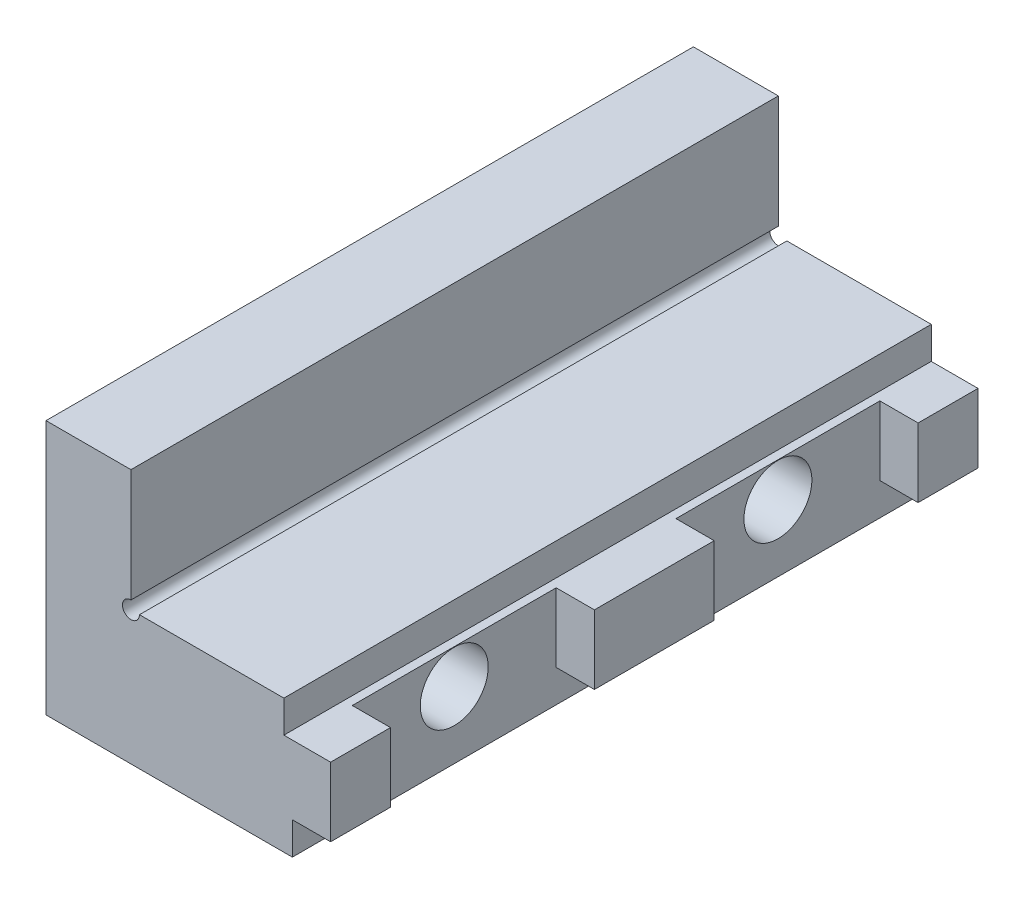
ISO-10303-21;
HEADER;
FILE_DESCRIPTION(('STEP AP214'),'2;1');
FILE_NAME('part.step','',(''),(''),'','','');
FILE_SCHEMA(('AUTOMOTIVE_DESIGN { 1 0 10303 214 1 1 1 1 }'));
ENDSEC;
DATA;
#1=APPLICATION_CONTEXT('core data for automotive mechanical design processes');
#2=APPLICATION_PROTOCOL_DEFINITION('international standard','automotive_design',2000,#1);
#3=PRODUCT_CONTEXT('',#1,'mechanical');
#4=PRODUCT('Part','Part','',(#3));
#5=PRODUCT_RELATED_PRODUCT_CATEGORY('part','',(#4));
#6=PRODUCT_DEFINITION_FORMATION('','',#4);
#7=PRODUCT_DEFINITION_CONTEXT('part definition',#1,'design');
#8=PRODUCT_DEFINITION('design','',#6,#7);
#9=PRODUCT_DEFINITION_SHAPE('','',#8);
#10=(LENGTH_UNIT() NAMED_UNIT(*) SI_UNIT(.MILLI.,.METRE.));
#11=(NAMED_UNIT(*) PLANE_ANGLE_UNIT() SI_UNIT($,.RADIAN.));
#12=(NAMED_UNIT(*) SI_UNIT($,.STERADIAN.) SOLID_ANGLE_UNIT());
#13=UNCERTAINTY_MEASURE_WITH_UNIT(LENGTH_MEASURE(1.E-05),#10,'distance_accuracy_value','');
#14=(GEOMETRIC_REPRESENTATION_CONTEXT(3) GLOBAL_UNCERTAINTY_ASSIGNED_CONTEXT((#13)) GLOBAL_UNIT_ASSIGNED_CONTEXT((#10,
#11,#12)) REPRESENTATION_CONTEXT('',''));
#15=CARTESIAN_POINT('',(0.,0.,0.));
#16=DIRECTION('',(0.,0.,1.));
#17=DIRECTION('',(1.,0.,0.));
#18=AXIS2_PLACEMENT_3D('',#15,#16,#17);
#19=CARTESIAN_POINT('',(0.,-11.8999610244505,38.1));
#20=DIRECTION('',(0.,-1.,0.));
#21=DIRECTION('',(0.,0.,-1.));
#22=AXIS2_PLACEMENT_3D('',#19,#20,#21);
#23=PLANE('',#22);
#24=DIRECTION('',(-1.,0.,0.));
#25=VECTOR('',#24,1.);
#26=CARTESIAN_POINT('',(0.,-11.8999610244505,31.05));
#27=LINE('',#26,#25);
#28=CARTESIAN_POINT('',(23.5,-11.8999610244505,31.05));
#29=VERTEX_POINT('',#28);
#30=CARTESIAN_POINT('',(19.,-11.8999610244505,31.05));
#31=VERTEX_POINT('',#30);
#32=EDGE_CURVE('E265',#29,#31,#27,.T.);
#33=ORIENTED_EDGE('',*,*,#32,.F.);
#34=DIRECTION('',(0.,0.,-1.));
#35=VECTOR('',#34,1.);
#36=CARTESIAN_POINT('',(23.5,-11.8999610244505,38.1));
#37=LINE('',#36,#35);
#38=CARTESIAN_POINT('',(23.5,-11.8999610244505,38.1));
#39=VERTEX_POINT('',#38);
#40=EDGE_CURVE('E189',#39,#29,#37,.T.);
#41=ORIENTED_EDGE('',*,*,#40,.F.);
#42=DIRECTION('',(-1.,0.,0.));
#43=VECTOR('',#42,1.);
#44=CARTESIAN_POINT('',(0.,-11.8999610244505,38.1));
#45=LINE('',#44,#43);
#46=CARTESIAN_POINT('',(19.,-11.8999610244505,38.1));
#47=VERTEX_POINT('',#46);
#48=EDGE_CURVE('E318',#39,#47,#45,.T.);
#49=ORIENTED_EDGE('',*,*,#48,.T.);
#50=DIRECTION('',(0.,0.,-1.));
#51=VECTOR('',#50,1.);
#52=CARTESIAN_POINT('',(19.,-11.8999610244505,38.1));
#53=LINE('',#52,#51);
#54=EDGE_CURVE('E191',#47,#31,#53,.T.);
#55=ORIENTED_EDGE('',*,*,#54,.T.);
#56=EDGE_LOOP('',(#33,#41,#49,#55));
#57=FACE_BOUND('',#56,.T.);
#58=ADVANCED_FACE('F37',(#57),#23,.T.);
#59=DIRECTION('',(1.,0.,0.));
#60=VECTOR('',#59,1.);
#61=CARTESIAN_POINT('',(0.,-11.8999610244505,7.05));
#62=LINE('',#61,#60);
#63=CARTESIAN_POINT('',(19.,-11.8999610244505,7.05));
#64=VERTEX_POINT('',#63);
#65=CARTESIAN_POINT('',(23.5,-11.8999610244505,7.05));
#66=VERTEX_POINT('',#65);
#67=EDGE_CURVE('E261',#64,#66,#62,.T.);
#68=ORIENTED_EDGE('',*,*,#67,.F.);
#69=CARTESIAN_POINT('',(19.,-11.8999610244505,-7.05));
#70=VERTEX_POINT('',#69);
#71=EDGE_CURVE('E188',#64,#70,#53,.T.);
#72=ORIENTED_EDGE('',*,*,#71,.T.);
#73=DIRECTION('',(-1.,0.,0.));
#74=VECTOR('',#73,1.);
#75=CARTESIAN_POINT('',(0.,-11.8999610244505,-7.05));
#76=LINE('',#75,#74);
#77=CARTESIAN_POINT('',(23.5,-11.8999610244505,-7.05));
#78=VERTEX_POINT('',#77);
#79=EDGE_CURVE('E258',#78,#70,#76,.T.);
#80=ORIENTED_EDGE('',*,*,#79,.F.);
#81=EDGE_CURVE('E194',#66,#78,#37,.T.);
#82=ORIENTED_EDGE('',*,*,#81,.F.);
#83=EDGE_LOOP('',(#68,#72,#80,#82));
#84=FACE_BOUND('',#83,.T.);
#85=ADVANCED_FACE('F360',(#84),#23,.T.);
#86=CARTESIAN_POINT('',(23.5,0.,38.1));
#87=DIRECTION('',(1.,0.,0.));
#88=DIRECTION('',(0.,1.,0.));
#89=AXIS2_PLACEMENT_3D('',#86,#87,#88);
#90=PLANE('',#89);
#91=DIRECTION('',(0.,-1.,0.));
#92=VECTOR('',#91,1.);
#93=CARTESIAN_POINT('',(23.5,0.,31.05));
#94=LINE('',#93,#92);
#95=CARTESIAN_POINT('',(23.5,-3.77996102445055,31.05));
#96=VERTEX_POINT('',#95);
#97=EDGE_CURVE('E263',#96,#29,#94,.T.);
#98=ORIENTED_EDGE('',*,*,#97,.F.);
#99=DIRECTION('',(0.,0.,-1.));
#100=VECTOR('',#99,1.);
#101=CARTESIAN_POINT('',(23.5,-3.77996102445055,38.1));
#102=LINE('',#101,#100);
#103=CARTESIAN_POINT('',(23.5,-3.77996102445055,38.1));
#104=VERTEX_POINT('',#103);
#105=EDGE_CURVE('E339',#104,#96,#102,.T.);
#106=ORIENTED_EDGE('',*,*,#105,.F.);
#107=DIRECTION('',(0.,-1.,0.));
#108=VECTOR('',#107,1.);
#109=CARTESIAN_POINT('',(23.5,0.,38.1));
#110=LINE('',#109,#108);
#111=EDGE_CURVE('E320',#104,#39,#110,.T.);
#112=ORIENTED_EDGE('',*,*,#111,.T.);
#113=ORIENTED_EDGE('',*,*,#40,.T.);
#114=EDGE_LOOP('',(#98,#106,#112,#113));
#115=FACE_BOUND('',#114,.T.);
#116=ADVANCED_FACE('F351',(#115),#90,.T.);
#117=DIRECTION('',(0.,1.,0.));
#118=VECTOR('',#117,1.);
#119=CARTESIAN_POINT('',(23.5,0.,7.05));
#120=LINE('',#119,#118);
#121=CARTESIAN_POINT('',(23.5,-3.77996102445055,7.05));
#122=VERTEX_POINT('',#121);
#123=EDGE_CURVE('E243',#66,#122,#120,.T.);
#124=ORIENTED_EDGE('',*,*,#123,.F.);
#125=ORIENTED_EDGE('',*,*,#81,.T.);
#126=DIRECTION('',(0.,-1.,0.));
#127=VECTOR('',#126,1.);
#128=CARTESIAN_POINT('',(23.5,0.,-7.05));
#129=LINE('',#128,#127);
#130=CARTESIAN_POINT('',(23.5,-3.77996102445055,-7.05));
#131=VERTEX_POINT('',#130);
#132=EDGE_CURVE('E180',#131,#78,#129,.T.);
#133=ORIENTED_EDGE('',*,*,#132,.F.);
#134=EDGE_CURVE('E340',#122,#131,#102,.T.);
#135=ORIENTED_EDGE('',*,*,#134,.F.);
#136=EDGE_LOOP('',(#124,#125,#133,#135));
#137=FACE_BOUND('',#136,.T.);
#138=ADVANCED_FACE('F352',(#137),#90,.T.);
#139=CARTESIAN_POINT('',(0.,0.,38.1));
#140=DIRECTION('',(0.,0.,-1.));
#141=DIRECTION('',(-1.,0.,0.));
#142=AXIS2_PLACEMENT_3D('',#139,#140,#141);
#143=CYLINDRICAL_SURFACE('',#142,1.);
#144=DIRECTION('',(0.,0.,-1.));
#145=VECTOR('',#144,1.);
#146=CARTESIAN_POINT('',(1.,0.,38.1));
#147=LINE('',#146,#145);
#148=CARTESIAN_POINT('',(1.,0.,38.1));
#149=VERTEX_POINT('',#148);
#150=CARTESIAN_POINT('',(1.,0.,-38.1));
#151=VERTEX_POINT('',#150);
#152=EDGE_CURVE('E332',#149,#151,#147,.T.);
#153=ORIENTED_EDGE('',*,*,#152,.T.);
#154=CARTESIAN_POINT('',(0.,0.,-38.1));
#155=DIRECTION('',(0.,0.,1.));
#156=DIRECTION('',(1.,0.,0.));
#157=AXIS2_PLACEMENT_3D('',#154,#155,#156);
#158=CIRCLE('',#157,1.);
#159=CARTESIAN_POINT('',(0.,1.,-38.1));
#160=VERTEX_POINT('',#159);
#161=EDGE_CURVE('E225',#160,#151,#158,.T.);
#162=ORIENTED_EDGE('',*,*,#161,.F.);
#163=DIRECTION('',(0.,0.,-1.));
#164=VECTOR('',#163,1.);
#165=CARTESIAN_POINT('',(0.,1.,38.1));
#166=LINE('',#165,#164);
#167=CARTESIAN_POINT('',(0.,1.,38.1));
#168=VERTEX_POINT('',#167);
#169=EDGE_CURVE('E210',#168,#160,#166,.T.);
#170=ORIENTED_EDGE('',*,*,#169,.F.);
#171=CARTESIAN_POINT('',(0.,0.,38.1));
#172=DIRECTION('',(0.,0.,1.));
#173=DIRECTION('',(1.,0.,0.));
#174=AXIS2_PLACEMENT_3D('',#171,#172,#173);
#175=CIRCLE('',#174,1.);
#176=EDGE_CURVE('E301',#168,#149,#175,.T.);
#177=ORIENTED_EDGE('',*,*,#176,.T.);
#178=EDGE_LOOP('',(#153,#162,#170,#177));
#179=FACE_BOUND('',#178,.T.);
#180=ADVANCED_FACE('F39',(#179),#143,.F.);
#181=CARTESIAN_POINT('',(0.,0.,38.1));
#182=DIRECTION('',(1.,0.,0.));
#183=DIRECTION('',(0.,1.,0.));
#184=AXIS2_PLACEMENT_3D('',#181,#182,#183);
#185=PLANE('',#184);
#186=ORIENTED_EDGE('',*,*,#169,.T.);
#187=DIRECTION('',(0.,-1.,0.));
#188=VECTOR('',#187,1.);
#189=CARTESIAN_POINT('',(0.,0.,-38.1));
#190=LINE('',#189,#188);
#191=CARTESIAN_POINT('',(0.,14.2850389755494,-38.1));
#192=VERTEX_POINT('',#191);
#193=EDGE_CURVE('E274',#192,#160,#190,.T.);
#194=ORIENTED_EDGE('',*,*,#193,.F.);
#195=DIRECTION('',(0.,0.,-1.));
#196=VECTOR('',#195,1.);
#197=CARTESIAN_POINT('',(0.,14.2850389755494,38.1));
#198=LINE('',#197,#196);
#199=CARTESIAN_POINT('',(0.,14.2850389755494,38.1));
#200=VERTEX_POINT('',#199);
#201=EDGE_CURVE('E208',#200,#192,#198,.T.);
#202=ORIENTED_EDGE('',*,*,#201,.F.);
#203=DIRECTION('',(0.,-1.,0.));
#204=VECTOR('',#203,1.);
#205=CARTESIAN_POINT('',(0.,0.,38.1));
#206=LINE('',#205,#204);
#207=EDGE_CURVE('E304',#200,#168,#206,.T.);
#208=ORIENTED_EDGE('',*,*,#207,.T.);
#209=EDGE_LOOP('',(#186,#194,#202,#208));
#210=FACE_BOUND('',#209,.T.);
#211=ADVANCED_FACE('F383',(#210),#185,.T.);
#212=CARTESIAN_POINT('',(0.,14.2850389755494,38.1));
#213=DIRECTION('',(0.,1.,0.));
#214=DIRECTION('',(0.,0.,1.));
#215=AXIS2_PLACEMENT_3D('',#212,#213,#214);
#216=PLANE('',#215);
#217=ORIENTED_EDGE('',*,*,#201,.T.);
#218=DIRECTION('',(1.,0.,0.));
#219=VECTOR('',#218,1.);
#220=CARTESIAN_POINT('',(0.,14.2850389755494,-38.1));
#221=LINE('',#220,#219);
#222=CARTESIAN_POINT('',(-10.,14.2850389755494,-38.1));
#223=VERTEX_POINT('',#222);
#224=EDGE_CURVE('E277',#223,#192,#221,.T.);
#225=ORIENTED_EDGE('',*,*,#224,.F.);
#226=DIRECTION('',(0.,0.,-1.));
#227=VECTOR('',#226,1.);
#228=CARTESIAN_POINT('',(-10.,14.2850389755494,38.1));
#229=LINE('',#228,#227);
#230=CARTESIAN_POINT('',(-10.,14.2850389755494,38.1));
#231=VERTEX_POINT('',#230);
#232=EDGE_CURVE('E204',#231,#223,#229,.T.);
#233=ORIENTED_EDGE('',*,*,#232,.F.);
#234=DIRECTION('',(1.,0.,0.));
#235=VECTOR('',#234,1.);
#236=CARTESIAN_POINT('',(0.,14.2850389755494,38.1));
#237=LINE('',#236,#235);
#238=EDGE_CURVE('E307',#231,#200,#237,.T.);
#239=ORIENTED_EDGE('',*,*,#238,.T.);
#240=EDGE_LOOP('',(#217,#225,#233,#239));
#241=FACE_BOUND('',#240,.T.);
#242=ADVANCED_FACE('F380',(#241),#216,.T.);
#243=CARTESIAN_POINT('',(-10.,0.,38.1));
#244=DIRECTION('',(-1.,0.,0.));
#245=DIRECTION('',(0.,0.,1.));
#246=AXIS2_PLACEMENT_3D('',#243,#244,#245);
#247=PLANE('',#246);
#248=CARTESIAN_POINT('',(-10.,-7.83996102445055,19.05));
#249=DIRECTION('',(-1.,0.,0.));
#250=DIRECTION('',(0.,0.,1.));
#251=AXIS2_PLACEMENT_3D('',#248,#249,#250);
#252=CIRCLE('',#251,6.5);
#253=CARTESIAN_POINT('',(-10.,-7.83996102445055,25.55));
#254=VERTEX_POINT('',#253);
#255=EDGE_CURVE('E222',#254,#254,#252,.T.);
#256=ORIENTED_EDGE('',*,*,#255,.F.);
#257=EDGE_LOOP('',(#256));
#258=FACE_BOUND('',#257,.T.);
#259=CARTESIAN_POINT('',(-10.,-7.83996102445054,-19.05));
#260=DIRECTION('',(-1.,0.,0.));
#261=DIRECTION('',(0.,0.,1.));
#262=AXIS2_PLACEMENT_3D('',#259,#260,#261);
#263=CIRCLE('',#262,6.5);
#264=CARTESIAN_POINT('',(-10.,-7.83996102445054,-12.55));
#265=VERTEX_POINT('',#264);
#266=EDGE_CURVE('E219',#265,#265,#263,.T.);
#267=ORIENTED_EDGE('',*,*,#266,.F.);
#268=EDGE_LOOP('',(#267));
#269=FACE_BOUND('',#268,.T.);
#270=ORIENTED_EDGE('',*,*,#232,.T.);
#271=DIRECTION('',(0.,1.,0.));
#272=VECTOR('',#271,1.);
#273=CARTESIAN_POINT('',(-10.,0.,-38.1));
#274=LINE('',#273,#272);
#275=CARTESIAN_POINT('',(-10.,-15.7149610244506,-38.1));
#276=VERTEX_POINT('',#275);
#277=EDGE_CURVE('E280',#276,#223,#274,.T.);
#278=ORIENTED_EDGE('',*,*,#277,.F.);
#279=DIRECTION('',(0.,0.,-1.));
#280=VECTOR('',#279,1.);
#281=CARTESIAN_POINT('',(-10.,-15.7149610244506,38.1));
#282=LINE('',#281,#280);
#283=CARTESIAN_POINT('',(-10.,-15.7149610244506,38.1));
#284=VERTEX_POINT('',#283);
#285=EDGE_CURVE('E202',#284,#276,#282,.T.);
#286=ORIENTED_EDGE('',*,*,#285,.F.);
#287=DIRECTION('',(0.,1.,0.));
#288=VECTOR('',#287,1.);
#289=CARTESIAN_POINT('',(-10.,0.,38.1));
#290=LINE('',#289,#288);
#291=EDGE_CURVE('E310',#284,#231,#290,.T.);
#292=ORIENTED_EDGE('',*,*,#291,.T.);
#293=EDGE_LOOP('',(#270,#278,#286,#292));
#294=FACE_BOUND('',#293,.T.);
#295=ADVANCED_FACE('F376',(#258,#269,#294),#247,.T.);
#296=CARTESIAN_POINT('',(0.,-15.7149610244506,38.1));
#297=DIRECTION('',(0.,-1.,0.));
#298=DIRECTION('',(1.,0.,0.));
#299=AXIS2_PLACEMENT_3D('',#296,#297,#298);
#300=PLANE('',#299);
#301=ORIENTED_EDGE('',*,*,#285,.T.);
#302=DIRECTION('',(-1.,0.,0.));
#303=VECTOR('',#302,1.);
#304=CARTESIAN_POINT('',(0.,-15.7149610244506,-38.1));
#305=LINE('',#304,#303);
#306=CARTESIAN_POINT('',(19.,-15.7149610244505,-38.1));
#307=VERTEX_POINT('',#306);
#308=EDGE_CURVE('E283',#307,#276,#305,.T.);
#309=ORIENTED_EDGE('',*,*,#308,.F.);
#310=DIRECTION('',(0.,0.,-1.));
#311=VECTOR('',#310,1.);
#312=CARTESIAN_POINT('',(19.,-15.7149610244505,38.1));
#313=LINE('',#312,#311);
#314=CARTESIAN_POINT('',(19.,-15.7149610244505,38.1));
#315=VERTEX_POINT('',#314);
#316=EDGE_CURVE('E198',#315,#307,#313,.T.);
#317=ORIENTED_EDGE('',*,*,#316,.F.);
#318=DIRECTION('',(-1.,0.,0.));
#319=VECTOR('',#318,1.);
#320=CARTESIAN_POINT('',(0.,-15.7149610244506,38.1));
#321=LINE('',#320,#319);
#322=EDGE_CURVE('E313',#315,#284,#321,.T.);
#323=ORIENTED_EDGE('',*,*,#322,.T.);
#324=EDGE_LOOP('',(#301,#309,#317,#323));
#325=FACE_BOUND('',#324,.T.);
#326=ADVANCED_FACE('F373',(#325),#300,.T.);
#327=CARTESIAN_POINT('',(19.,0.,38.1));
#328=DIRECTION('',(1.,0.,0.));
#329=DIRECTION('',(0.,1.,0.));
#330=AXIS2_PLACEMENT_3D('',#327,#328,#329);
#331=PLANE('',#330);
#332=CARTESIAN_POINT('',(19.,-11.8999610244505,-31.05));
#333=VERTEX_POINT('',#332);
#334=CARTESIAN_POINT('',(19.,-11.8999610244505,-38.1));
#335=VERTEX_POINT('',#334);
#336=EDGE_CURVE('E177',#333,#335,#53,.T.);
#337=ORIENTED_EDGE('',*,*,#336,.F.);
#338=DIRECTION('',(0.,-1.,0.));
#339=VECTOR('',#338,1.);
#340=CARTESIAN_POINT('',(19.,0.,-31.05));
#341=LINE('',#340,#339);
#342=CARTESIAN_POINT('',(19.,-3.77996102445055,-31.05));
#343=VERTEX_POINT('',#342);
#344=EDGE_CURVE('E59',#343,#333,#341,.T.);
#345=ORIENTED_EDGE('',*,*,#344,.F.);
#346=DIRECTION('',(0.,0.,1.));
#347=VECTOR('',#346,1.);
#348=CARTESIAN_POINT('',(19.,-3.77996102445055,38.1));
#349=LINE('',#348,#347);
#350=CARTESIAN_POINT('',(19.,-3.77996102445055,-7.05));
#351=VERTEX_POINT('',#350);
#352=EDGE_CURVE('E229',#343,#351,#349,.T.);
#353=ORIENTED_EDGE('',*,*,#352,.T.);
#354=DIRECTION('',(0.,1.,0.));
#355=VECTOR('',#354,1.);
#356=CARTESIAN_POINT('',(19.,0.,-7.05));
#357=LINE('',#356,#355);
#358=EDGE_CURVE('E171',#70,#351,#357,.T.);
#359=ORIENTED_EDGE('',*,*,#358,.F.);
#360=ORIENTED_EDGE('',*,*,#71,.F.);
#361=DIRECTION('',(0.,-1.,0.));
#362=VECTOR('',#361,1.);
#363=CARTESIAN_POINT('',(19.,0.,7.05));
#364=LINE('',#363,#362);
#365=CARTESIAN_POINT('',(19.,-3.77996102445055,7.05000000000001));
#366=VERTEX_POINT('',#365);
#367=EDGE_CURVE('E52',#366,#64,#364,.T.);
#368=ORIENTED_EDGE('',*,*,#367,.F.);
#369=DIRECTION('',(0.,0.,1.));
#370=VECTOR('',#369,1.);
#371=CARTESIAN_POINT('',(19.,-3.77996102445055,38.1));
#372=LINE('',#371,#370);
#373=CARTESIAN_POINT('',(19.,-3.77996102445055,31.05));
#374=VERTEX_POINT('',#373);
#375=EDGE_CURVE('E234',#366,#374,#372,.T.);
#376=ORIENTED_EDGE('',*,*,#375,.T.);
#377=DIRECTION('',(0.,1.,0.));
#378=VECTOR('',#377,1.);
#379=CARTESIAN_POINT('',(19.,0.,31.05));
#380=LINE('',#379,#378);
#381=EDGE_CURVE('E230',#31,#374,#380,.T.);
#382=ORIENTED_EDGE('',*,*,#381,.F.);
#383=ORIENTED_EDGE('',*,*,#54,.F.);
#384=DIRECTION('',(0.,-1.,0.));
#385=VECTOR('',#384,1.);
#386=CARTESIAN_POINT('',(19.,0.,38.1));
#387=LINE('',#386,#385);
#388=EDGE_CURVE('E316',#47,#315,#387,.T.);
#389=ORIENTED_EDGE('',*,*,#388,.T.);
#390=ORIENTED_EDGE('',*,*,#316,.T.);
#391=DIRECTION('',(0.,-1.,0.));
#392=VECTOR('',#391,1.);
#393=CARTESIAN_POINT('',(19.,0.,-38.1));
#394=LINE('',#393,#392);
#395=EDGE_CURVE('E187',#335,#307,#394,.T.);
#396=ORIENTED_EDGE('',*,*,#395,.F.);
#397=EDGE_LOOP('',(#337,#345,#353,#359,#360,#368,#376,#382,#383,#389,#390,#396));
#398=FACE_BOUND('',#397,.T.);
#399=CARTESIAN_POINT('',(19.,-7.83996102445054,-19.05));
#400=DIRECTION('',(-1.,0.,0.));
#401=DIRECTION('',(0.,-1.,0.));
#402=AXIS2_PLACEMENT_3D('',#399,#400,#401);
#403=CIRCLE('',#402,4.);
#404=CARTESIAN_POINT('',(19.,-11.8399610244505,-19.05));
#405=VERTEX_POINT('',#404);
#406=EDGE_CURVE('E226',#405,#405,#403,.F.);
#407=ORIENTED_EDGE('',*,*,#406,.F.);
#408=EDGE_LOOP('',(#407));
#409=FACE_BOUND('',#408,.T.);
#410=CARTESIAN_POINT('',(19.,-7.83996102445055,19.05));
#411=DIRECTION('',(-1.,0.,0.));
#412=DIRECTION('',(0.,-1.,0.));
#413=AXIS2_PLACEMENT_3D('',#410,#411,#412);
#414=CIRCLE('',#413,4.);
#415=CARTESIAN_POINT('',(19.,-11.8399610244505,19.05));
#416=VERTEX_POINT('',#415);
#417=EDGE_CURVE('E231',#416,#416,#414,.F.);
#418=ORIENTED_EDGE('',*,*,#417,.F.);
#419=EDGE_LOOP('',(#418));
#420=FACE_BOUND('',#419,.T.);
#421=ADVANCED_FACE('F184',(#398,#409,#420),#331,.T.);
#422=DIRECTION('',(1.,0.,0.));
#423=VECTOR('',#422,1.);
#424=CARTESIAN_POINT('',(0.,-11.8999610244505,-31.05));
#425=LINE('',#424,#423);
#426=CARTESIAN_POINT('',(23.5,-11.8999610244505,-31.05));
#427=VERTEX_POINT('',#426);
#428=EDGE_CURVE('E166',#333,#427,#425,.T.);
#429=ORIENTED_EDGE('',*,*,#428,.F.);
#430=ORIENTED_EDGE('',*,*,#336,.T.);
#431=DIRECTION('',(-1.,0.,0.));
#432=VECTOR('',#431,1.);
#433=CARTESIAN_POINT('',(0.,-11.8999610244505,-38.1));
#434=LINE('',#433,#432);
#435=CARTESIAN_POINT('',(23.5,-11.8999610244505,-38.1));
#436=VERTEX_POINT('',#435);
#437=EDGE_CURVE('E287',#436,#335,#434,.T.);
#438=ORIENTED_EDGE('',*,*,#437,.F.);
#439=EDGE_CURVE('E179',#427,#436,#37,.T.);
#440=ORIENTED_EDGE('',*,*,#439,.F.);
#441=EDGE_LOOP('',(#429,#430,#438,#440));
#442=FACE_BOUND('',#441,.T.);
#443=ADVANCED_FACE('F175',(#442),#23,.T.);
#444=DIRECTION('',(0.,1.,0.));
#445=VECTOR('',#444,1.);
#446=CARTESIAN_POINT('',(23.5,0.,-31.05));
#447=LINE('',#446,#445);
#448=CARTESIAN_POINT('',(23.5,-3.77996102445055,-31.05));
#449=VERTEX_POINT('',#448);
#450=EDGE_CURVE('E181',#427,#449,#447,.T.);
#451=ORIENTED_EDGE('',*,*,#450,.F.);
#452=ORIENTED_EDGE('',*,*,#439,.T.);
#453=DIRECTION('',(0.,-1.,0.));
#454=VECTOR('',#453,1.);
#455=CARTESIAN_POINT('',(23.5,0.,-38.1));
#456=LINE('',#455,#454);
#457=CARTESIAN_POINT('',(23.5,-3.77996102445055,-38.1));
#458=VERTEX_POINT('',#457);
#459=EDGE_CURVE('E289',#458,#436,#456,.T.);
#460=ORIENTED_EDGE('',*,*,#459,.F.);
#461=EDGE_CURVE('E338',#449,#458,#102,.T.);
#462=ORIENTED_EDGE('',*,*,#461,.F.);
#463=EDGE_LOOP('',(#451,#452,#460,#462));
#464=FACE_BOUND('',#463,.T.);
#465=ADVANCED_FACE('F348',(#464),#90,.T.);
#466=CARTESIAN_POINT('',(0.,-3.77996102445055,38.1));
#467=DIRECTION('',(0.,1.,0.));
#468=DIRECTION('',(0.,0.,1.));
#469=AXIS2_PLACEMENT_3D('',#466,#467,#468);
#470=PLANE('',#469);
#471=DIRECTION('',(1.,0.,0.));
#472=VECTOR('',#471,1.);
#473=CARTESIAN_POINT('',(0.,-3.77996102445055,31.05));
#474=LINE('',#473,#472);
#475=EDGE_CURVE('E11',#374,#96,#474,.T.);
#476=ORIENTED_EDGE('',*,*,#475,.F.);
#477=ORIENTED_EDGE('',*,*,#375,.F.);
#478=DIRECTION('',(-1.,0.,0.));
#479=VECTOR('',#478,1.);
#480=CARTESIAN_POINT('',(0.,-3.77996102445055,7.05));
#481=LINE('',#480,#479);
#482=EDGE_CURVE('E45',#122,#366,#481,.T.);
#483=ORIENTED_EDGE('',*,*,#482,.F.);
#484=ORIENTED_EDGE('',*,*,#134,.T.);
#485=DIRECTION('',(1.,0.,0.));
#486=VECTOR('',#485,1.);
#487=CARTESIAN_POINT('',(0.,-3.77996102445055,-7.05));
#488=LINE('',#487,#486);
#489=EDGE_CURVE('E236',#351,#131,#488,.T.);
#490=ORIENTED_EDGE('',*,*,#489,.F.);
#491=ORIENTED_EDGE('',*,*,#352,.F.);
#492=DIRECTION('',(-1.,0.,0.));
#493=VECTOR('',#492,1.);
#494=CARTESIAN_POINT('',(0.,-3.77996102445055,-31.05));
#495=LINE('',#494,#493);
#496=EDGE_CURVE('E169',#449,#343,#495,.T.);
#497=ORIENTED_EDGE('',*,*,#496,.F.);
#498=ORIENTED_EDGE('',*,*,#461,.T.);
#499=DIRECTION('',(1.,0.,0.));
#500=VECTOR('',#499,1.);
#501=CARTESIAN_POINT('',(0.,-3.77996102445055,-38.1));
#502=LINE('',#501,#500);
#503=CARTESIAN_POINT('',(18.,-3.77996102445055,-38.1));
#504=VERTEX_POINT('',#503);
#505=EDGE_CURVE('E292',#504,#458,#502,.T.);
#506=ORIENTED_EDGE('',*,*,#505,.F.);
#507=DIRECTION('',(0.,0.,-1.));
#508=VECTOR('',#507,1.);
#509=CARTESIAN_POINT('',(18.,-3.77996102445055,38.1));
#510=LINE('',#509,#508);
#511=CARTESIAN_POINT('',(18.,-3.77996102445055,38.1));
#512=VERTEX_POINT('',#511);
#513=EDGE_CURVE('E336',#512,#504,#510,.T.);
#514=ORIENTED_EDGE('',*,*,#513,.F.);
#515=DIRECTION('',(1.,0.,0.));
#516=VECTOR('',#515,1.);
#517=CARTESIAN_POINT('',(0.,-3.77996102445055,38.1));
#518=LINE('',#517,#516);
#519=EDGE_CURVE('E323',#512,#104,#518,.T.);
#520=ORIENTED_EDGE('',*,*,#519,.T.);
#521=ORIENTED_EDGE('',*,*,#105,.T.);
#522=EDGE_LOOP('',(#476,#477,#483,#484,#490,#491,#497,#498,#506,#514,#520,#521));
#523=FACE_BOUND('',#522,.T.);
#524=ADVANCED_FACE('F248',(#523),#470,.T.);
#525=CARTESIAN_POINT('',(18.,0.,38.1));
#526=DIRECTION('',(1.,0.,0.));
#527=DIRECTION('',(0.,1.,0.));
#528=AXIS2_PLACEMENT_3D('',#525,#526,#527);
#529=PLANE('',#528);
#530=ORIENTED_EDGE('',*,*,#513,.T.);
#531=DIRECTION('',(0.,-1.,0.));
#532=VECTOR('',#531,1.);
#533=CARTESIAN_POINT('',(18.,0.,-38.1));
#534=LINE('',#533,#532);
#535=CARTESIAN_POINT('',(18.,0.,-38.1));
#536=VERTEX_POINT('',#535);
#537=EDGE_CURVE('E295',#536,#504,#534,.T.);
#538=ORIENTED_EDGE('',*,*,#537,.F.);
#539=DIRECTION('',(0.,0.,-1.));
#540=VECTOR('',#539,1.);
#541=CARTESIAN_POINT('',(18.,0.,38.1));
#542=LINE('',#541,#540);
#543=CARTESIAN_POINT('',(18.,0.,38.1));
#544=VERTEX_POINT('',#543);
#545=EDGE_CURVE('E334',#544,#536,#542,.T.);
#546=ORIENTED_EDGE('',*,*,#545,.F.);
#547=DIRECTION('',(0.,-1.,0.));
#548=VECTOR('',#547,1.);
#549=CARTESIAN_POINT('',(18.,0.,38.1));
#550=LINE('',#549,#548);
#551=EDGE_CURVE('E326',#544,#512,#550,.T.);
#552=ORIENTED_EDGE('',*,*,#551,.T.);
#553=EDGE_LOOP('',(#530,#538,#546,#552));
#554=FACE_BOUND('',#553,.T.);
#555=ADVANCED_FACE('F357',(#554),#529,.T.);
#556=CARTESIAN_POINT('',(0.,0.,38.1));
#557=DIRECTION('',(0.,1.,0.));
#558=DIRECTION('',(0.,0.,1.));
#559=AXIS2_PLACEMENT_3D('',#556,#557,#558);
#560=PLANE('',#559);
#561=ORIENTED_EDGE('',*,*,#545,.T.);
#562=DIRECTION('',(1.,0.,0.));
#563=VECTOR('',#562,1.);
#564=CARTESIAN_POINT('',(0.,0.,-38.1));
#565=LINE('',#564,#563);
#566=EDGE_CURVE('E298',#151,#536,#565,.T.);
#567=ORIENTED_EDGE('',*,*,#566,.F.);
#568=ORIENTED_EDGE('',*,*,#152,.F.);
#569=DIRECTION('',(1.,0.,0.));
#570=VECTOR('',#569,1.);
#571=CARTESIAN_POINT('',(0.,0.,38.1));
#572=LINE('',#571,#570);
#573=EDGE_CURVE('E329',#149,#544,#572,.T.);
#574=ORIENTED_EDGE('',*,*,#573,.T.);
#575=EDGE_LOOP('',(#561,#567,#568,#574));
#576=FACE_BOUND('',#575,.T.);
#577=ADVANCED_FACE('F399',(#576),#560,.T.);
#578=CARTESIAN_POINT('',(0.,0.,38.1));
#579=DIRECTION('',(0.,0.,1.));
#580=DIRECTION('',(1.,0.,0.));
#581=AXIS2_PLACEMENT_3D('',#578,#579,#580);
#582=PLANE('',#581);
#583=ORIENTED_EDGE('',*,*,#176,.F.);
#584=ORIENTED_EDGE('',*,*,#207,.F.);
#585=ORIENTED_EDGE('',*,*,#238,.F.);
#586=ORIENTED_EDGE('',*,*,#291,.F.);
#587=ORIENTED_EDGE('',*,*,#322,.F.);
#588=ORIENTED_EDGE('',*,*,#388,.F.);
#589=ORIENTED_EDGE('',*,*,#48,.F.);
#590=ORIENTED_EDGE('',*,*,#111,.F.);
#591=ORIENTED_EDGE('',*,*,#519,.F.);
#592=ORIENTED_EDGE('',*,*,#551,.F.);
#593=ORIENTED_EDGE('',*,*,#573,.F.);
#594=EDGE_LOOP('',(#583,#584,#585,#586,#587,#588,#589,#590,#591,#592,#593));
#595=FACE_BOUND('',#594,.T.);
#596=ADVANCED_FACE('F405',(#595),#582,.T.);
#597=CARTESIAN_POINT('',(0.,0.,-38.1));
#598=DIRECTION('',(0.,0.,1.));
#599=DIRECTION('',(1.,0.,0.));
#600=AXIS2_PLACEMENT_3D('',#597,#598,#599);
#601=PLANE('',#600);
#602=ORIENTED_EDGE('',*,*,#161,.T.);
#603=ORIENTED_EDGE('',*,*,#566,.T.);
#604=ORIENTED_EDGE('',*,*,#537,.T.);
#605=ORIENTED_EDGE('',*,*,#505,.T.);
#606=ORIENTED_EDGE('',*,*,#459,.T.);
#607=ORIENTED_EDGE('',*,*,#437,.T.);
#608=ORIENTED_EDGE('',*,*,#395,.T.);
#609=ORIENTED_EDGE('',*,*,#308,.T.);
#610=ORIENTED_EDGE('',*,*,#277,.T.);
#611=ORIENTED_EDGE('',*,*,#224,.T.);
#612=ORIENTED_EDGE('',*,*,#193,.T.);
#613=EDGE_LOOP('',(#602,#603,#604,#605,#606,#607,#608,#609,#610,#611,#612));
#614=FACE_BOUND('',#613,.T.);
#615=ADVANCED_FACE('F346',(#614),#601,.F.);
#616=CARTESIAN_POINT('',(-30.,-7.83996102445055,19.05));
#617=DIRECTION('',(1.,0.,0.));
#618=DIRECTION('',(0.,0.,-1.));
#619=AXIS2_PLACEMENT_3D('',#616,#617,#618);
#620=CYLINDRICAL_SURFACE('',#619,4.);
#621=ORIENTED_EDGE('',*,*,#417,.T.);
#622=EDGE_LOOP('',(#621));
#623=FACE_BOUND('',#622,.T.);
#624=CARTESIAN_POINT('',(0.,-7.83996102445055,19.05));
#625=DIRECTION('',(1.,0.,0.));
#626=DIRECTION('',(0.,0.,-1.));
#627=AXIS2_PLACEMENT_3D('',#624,#625,#626);
#628=CIRCLE('',#627,4.);
#629=CARTESIAN_POINT('',(0.,-7.83996102445055,15.05));
#630=VERTEX_POINT('',#629);
#631=EDGE_CURVE('E215',#630,#630,#628,.F.);
#632=ORIENTED_EDGE('',*,*,#631,.T.);
#633=EDGE_LOOP('',(#632));
#634=FACE_BOUND('',#633,.T.);
#635=ADVANCED_FACE('F450',(#623,#634),#620,.F.);
#636=CARTESIAN_POINT('',(-30.,-7.83996102445054,-19.05));
#637=DIRECTION('',(1.,0.,0.));
#638=DIRECTION('',(0.,0.,-1.));
#639=AXIS2_PLACEMENT_3D('',#636,#637,#638);
#640=CYLINDRICAL_SURFACE('',#639,4.);
#641=ORIENTED_EDGE('',*,*,#406,.T.);
#642=EDGE_LOOP('',(#641));
#643=FACE_BOUND('',#642,.T.);
#644=CARTESIAN_POINT('',(0.,-7.83996102445054,-19.05));
#645=DIRECTION('',(1.,0.,0.));
#646=DIRECTION('',(0.,0.,-1.));
#647=AXIS2_PLACEMENT_3D('',#644,#645,#646);
#648=CIRCLE('',#647,4.);
#649=CARTESIAN_POINT('',(0.,-7.83996102445054,-23.05));
#650=VERTEX_POINT('',#649);
#651=EDGE_CURVE('E212',#650,#650,#648,.F.);
#652=ORIENTED_EDGE('',*,*,#651,.T.);
#653=EDGE_LOOP('',(#652));
#654=FACE_BOUND('',#653,.T.);
#655=ADVANCED_FACE('F443',(#643,#654),#640,.F.);
#656=CARTESIAN_POINT('',(0.,-7.83996102445054,-19.05));
#657=DIRECTION('',(1.,0.,0.));
#658=DIRECTION('',(0.,0.,-1.));
#659=AXIS2_PLACEMENT_3D('',#656,#657,#658);
#660=PLANE('',#659);
#661=CARTESIAN_POINT('',(0.,-7.83996102445054,-19.05));
#662=DIRECTION('',(1.,0.,0.));
#663=DIRECTION('',(0.,0.,-1.));
#664=AXIS2_PLACEMENT_3D('',#661,#662,#663);
#665=CIRCLE('',#664,6.5);
#666=CARTESIAN_POINT('',(0.,-7.83996102445054,-25.55));
#667=VERTEX_POINT('',#666);
#668=EDGE_CURVE('E267',#667,#667,#665,.T.);
#669=ORIENTED_EDGE('',*,*,#668,.F.);
#670=EDGE_LOOP('',(#669));
#671=FACE_BOUND('',#670,.T.);
#672=ORIENTED_EDGE('',*,*,#651,.F.);
#673=EDGE_LOOP('',(#672));
#674=FACE_BOUND('',#673,.T.);
#675=ADVANCED_FACE('F440',(#671,#674),#660,.F.);
#676=CARTESIAN_POINT('',(-18.2,-7.83996102445054,-19.05));
#677=DIRECTION('',(1.,0.,0.));
#678=DIRECTION('',(0.,0.,-1.));
#679=AXIS2_PLACEMENT_3D('',#676,#677,#678);
#680=CYLINDRICAL_SURFACE('',#679,6.5);
#681=ORIENTED_EDGE('',*,*,#266,.T.);
#682=EDGE_LOOP('',(#681));
#683=FACE_BOUND('',#682,.T.);
#684=ORIENTED_EDGE('',*,*,#668,.T.);
#685=EDGE_LOOP('',(#684));
#686=FACE_BOUND('',#685,.T.);
#687=ADVANCED_FACE('F437',(#683,#686),#680,.F.);
#688=CARTESIAN_POINT('',(0.,-7.83996102445055,19.05));
#689=DIRECTION('',(1.,0.,0.));
#690=DIRECTION('',(0.,0.,-1.));
#691=AXIS2_PLACEMENT_3D('',#688,#689,#690);
#692=PLANE('',#691);
#693=CARTESIAN_POINT('',(0.,-7.83996102445055,19.05));
#694=DIRECTION('',(1.,0.,0.));
#695=DIRECTION('',(0.,0.,-1.));
#696=AXIS2_PLACEMENT_3D('',#693,#694,#695);
#697=CIRCLE('',#696,6.5);
#698=CARTESIAN_POINT('',(0.,-7.83996102445055,12.55));
#699=VERTEX_POINT('',#698);
#700=EDGE_CURVE('E216',#699,#699,#697,.T.);
#701=ORIENTED_EDGE('',*,*,#700,.F.);
#702=EDGE_LOOP('',(#701));
#703=FACE_BOUND('',#702,.T.);
#704=ORIENTED_EDGE('',*,*,#631,.F.);
#705=EDGE_LOOP('',(#704));
#706=FACE_BOUND('',#705,.T.);
#707=ADVANCED_FACE('F430',(#703,#706),#692,.F.);
#708=CARTESIAN_POINT('',(-18.2,-7.83996102445055,19.05));
#709=DIRECTION('',(1.,0.,0.));
#710=DIRECTION('',(0.,0.,-1.));
#711=AXIS2_PLACEMENT_3D('',#708,#709,#710);
#712=CYLINDRICAL_SURFACE('',#711,6.5);
#713=ORIENTED_EDGE('',*,*,#255,.T.);
#714=EDGE_LOOP('',(#713));
#715=FACE_BOUND('',#714,.T.);
#716=ORIENTED_EDGE('',*,*,#700,.T.);
#717=EDGE_LOOP('',(#716));
#718=FACE_BOUND('',#717,.T.);
#719=ADVANCED_FACE('F423',(#715,#718),#712,.F.);
#720=CARTESIAN_POINT('',(29.,0.,-7.05));
#721=DIRECTION('',(0.,0.,1.));
#722=DIRECTION('',(0.,-1.,0.));
#723=AXIS2_PLACEMENT_3D('',#720,#721,#722);
#724=PLANE('',#723);
#725=ORIENTED_EDGE('',*,*,#79,.T.);
#726=ORIENTED_EDGE('',*,*,#358,.T.);
#727=ORIENTED_EDGE('',*,*,#489,.T.);
#728=ORIENTED_EDGE('',*,*,#132,.T.);
#729=EDGE_LOOP('',(#725,#726,#727,#728));
#730=FACE_BOUND('',#729,.T.);
#731=ADVANCED_FACE('F417',(#730),#724,.F.);
#732=CARTESIAN_POINT('',(29.,0.,-31.05));
#733=DIRECTION('',(0.,0.,-1.));
#734=DIRECTION('',(0.,1.,0.));
#735=AXIS2_PLACEMENT_3D('',#732,#733,#734);
#736=PLANE('',#735);
#737=ORIENTED_EDGE('',*,*,#428,.T.);
#738=ORIENTED_EDGE('',*,*,#450,.T.);
#739=ORIENTED_EDGE('',*,*,#496,.T.);
#740=ORIENTED_EDGE('',*,*,#344,.T.);
#741=EDGE_LOOP('',(#737,#738,#739,#740));
#742=FACE_BOUND('',#741,.T.);
#743=ADVANCED_FACE('F165',(#742),#736,.F.);
#744=CARTESIAN_POINT('',(29.,0.,31.05));
#745=DIRECTION('',(0.,0.,1.));
#746=DIRECTION('',(1.,0.,0.));
#747=AXIS2_PLACEMENT_3D('',#744,#745,#746);
#748=PLANE('',#747);
#749=ORIENTED_EDGE('',*,*,#32,.T.);
#750=ORIENTED_EDGE('',*,*,#381,.T.);
#751=ORIENTED_EDGE('',*,*,#475,.T.);
#752=ORIENTED_EDGE('',*,*,#97,.T.);
#753=EDGE_LOOP('',(#749,#750,#751,#752));
#754=FACE_BOUND('',#753,.T.);
#755=ADVANCED_FACE('F410',(#754),#748,.F.);
#756=CARTESIAN_POINT('',(29.,0.,7.05));
#757=DIRECTION('',(0.,0.,-1.));
#758=DIRECTION('',(-1.,0.,0.));
#759=AXIS2_PLACEMENT_3D('',#756,#757,#758);
#760=PLANE('',#759);
#761=ORIENTED_EDGE('',*,*,#67,.T.);
#762=ORIENTED_EDGE('',*,*,#123,.T.);
#763=ORIENTED_EDGE('',*,*,#482,.T.);
#764=ORIENTED_EDGE('',*,*,#367,.T.);
#765=EDGE_LOOP('',(#761,#762,#763,#764));
#766=FACE_BOUND('',#765,.T.);
#767=ADVANCED_FACE('F240',(#766),#760,.F.);
#768=CLOSED_SHELL('',(#58,#85,#116,#138,#180,#211,#242,#295,#326,#421,#443,#465,#524,#555,#577,
#596,#615,#635,#655,#675,#687,#707,#719,#731,#743,#755,#767));
#769=MANIFOLD_SOLID_BREP('B2',#768);
#770=ADVANCED_BREP_SHAPE_REPRESENTATION('',(#18,#769),#14);
#771=SHAPE_DEFINITION_REPRESENTATION(#9,#770);
ENDSEC;
END-ISO-10303-21;
